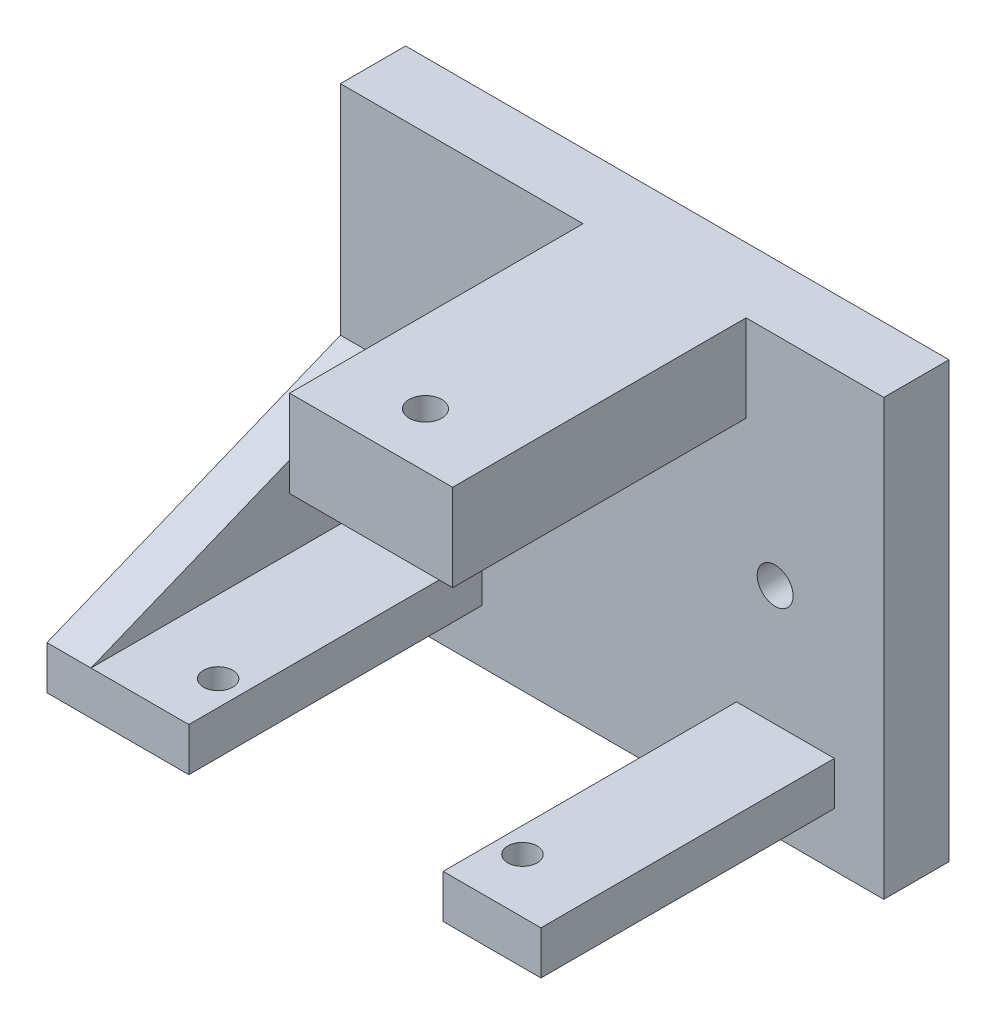
ISO-10303-21;
HEADER;
FILE_DESCRIPTION(('STEP AP214'),'2;1');
FILE_NAME('part.step','',(''),(''),'','','');
FILE_SCHEMA(('AUTOMOTIVE_DESIGN { 1 0 10303 214 1 1 1 1 }'));
ENDSEC;
DATA;
#1=APPLICATION_CONTEXT('core data for automotive mechanical design processes');
#2=APPLICATION_PROTOCOL_DEFINITION('international standard','automotive_design',2000,#1);
#3=PRODUCT_CONTEXT('',#1,'mechanical');
#4=PRODUCT('Part','Part','',(#3));
#5=PRODUCT_RELATED_PRODUCT_CATEGORY('part','',(#4));
#6=PRODUCT_DEFINITION_FORMATION('','',#4);
#7=PRODUCT_DEFINITION_CONTEXT('part definition',#1,'design');
#8=PRODUCT_DEFINITION('design','',#6,#7);
#9=PRODUCT_DEFINITION_SHAPE('','',#8);
#10=(LENGTH_UNIT() NAMED_UNIT(*) SI_UNIT(.MILLI.,.METRE.));
#11=(NAMED_UNIT(*) PLANE_ANGLE_UNIT() SI_UNIT($,.RADIAN.));
#12=(NAMED_UNIT(*) SI_UNIT($,.STERADIAN.) SOLID_ANGLE_UNIT());
#13=UNCERTAINTY_MEASURE_WITH_UNIT(LENGTH_MEASURE(1.E-05),#10,'distance_accuracy_value','');
#14=(GEOMETRIC_REPRESENTATION_CONTEXT(3) GLOBAL_UNCERTAINTY_ASSIGNED_CONTEXT((#13)) GLOBAL_UNIT_ASSIGNED_CONTEXT((#10,
#11,#12)) REPRESENTATION_CONTEXT('',''));
#15=CARTESIAN_POINT('',(0.,0.,0.));
#16=DIRECTION('',(0.,0.,1.));
#17=DIRECTION('',(1.,0.,0.));
#18=AXIS2_PLACEMENT_3D('',#15,#16,#17);
#19=CARTESIAN_POINT('',(0.,0.,6.));
#20=DIRECTION('',(0.,0.,1.));
#21=DIRECTION('',(1.,0.,0.));
#22=AXIS2_PLACEMENT_3D('',#19,#20,#21);
#23=PLANE('',#22);
#24=DIRECTION('',(0.,1.,0.));
#25=VECTOR('',#24,1.);
#26=CARTESIAN_POINT('',(231.451074565597,12.,6.));
#27=LINE('',#26,#25);
#28=CARTESIAN_POINT('',(231.451074565597,12.,6.));
#29=VERTEX_POINT('',#28);
#30=CARTESIAN_POINT('',(231.451074565597,20.,6.));
#31=VERTEX_POINT('',#30);
#32=EDGE_CURVE('E183',#29,#31,#27,.T.);
#33=ORIENTED_EDGE('',*,*,#32,.T.);
#34=DIRECTION('',(-1.,0.,0.));
#35=VECTOR('',#34,1.);
#36=CARTESIAN_POINT('',(209.126074565596,20.,6.));
#37=LINE('',#36,#35);
#38=CARTESIAN_POINT('',(209.126074565596,20.,6.));
#39=VERTEX_POINT('',#38);
#40=EDGE_CURVE('E300',#31,#39,#37,.T.);
#41=ORIENTED_EDGE('',*,*,#40,.T.);
#42=DIRECTION('',(0.,-1.,0.));
#43=VECTOR('',#42,1.);
#44=CARTESIAN_POINT('',(209.126074565596,20.,6.));
#45=LINE('',#44,#43);
#46=CARTESIAN_POINT('',(209.126074565596,-0.0416427874293489,6.));
#47=VERTEX_POINT('',#46);
#48=EDGE_CURVE('E305',#39,#47,#45,.T.);
#49=ORIENTED_EDGE('',*,*,#48,.T.);
#50=DIRECTION('',(1.,0.,0.));
#51=VECTOR('',#50,1.);
#52=CARTESIAN_POINT('',(178.239184142635,-0.0416427874293489,6.));
#53=LINE('',#52,#51);
#54=CARTESIAN_POINT('',(213.176074565597,-0.0416427874293489,6.));
#55=VERTEX_POINT('',#54);
#56=EDGE_CURVE('E217',#47,#55,#53,.T.);
#57=ORIENTED_EDGE('',*,*,#56,.T.);
#58=DIRECTION('',(0.,-1.,0.));
#59=VECTOR('',#58,1.);
#60=CARTESIAN_POINT('',(213.176074565597,-15.0416427874293,6.));
#61=LINE('',#60,#59);
#62=CARTESIAN_POINT('',(213.176074565597,-11.0416427874293,6.));
#63=VERTEX_POINT('',#62);
#64=EDGE_CURVE('E214',#55,#63,#61,.T.);
#65=ORIENTED_EDGE('',*,*,#64,.T.);
#66=DIRECTION('',(-1.,0.,0.));
#67=VECTOR('',#66,1.);
#68=CARTESIAN_POINT('',(213.176074565597,-11.0416427874293,6.));
#69=LINE('',#68,#67);
#70=CARTESIAN_POINT('',(222.176074565597,-11.0416427874293,6.));
#71=VERTEX_POINT('',#70);
#72=EDGE_CURVE('E274',#71,#63,#69,.T.);
#73=ORIENTED_EDGE('',*,*,#72,.F.);
#74=DIRECTION('',(0.,1.,0.));
#75=VECTOR('',#74,1.);
#76=CARTESIAN_POINT('',(222.176074565597,-11.0416427874293,6.));
#77=LINE('',#76,#75);
#78=CARTESIAN_POINT('',(222.176074565597,-15.0416427874294,6.));
#79=VERTEX_POINT('',#78);
#80=EDGE_CURVE('E254',#79,#71,#77,.T.);
#81=ORIENTED_EDGE('',*,*,#80,.F.);
#82=DIRECTION('',(1.,0.,0.));
#83=VECTOR('',#82,1.);
#84=CARTESIAN_POINT('',(213.176074565597,-15.0416427874293,6.));
#85=LINE('',#84,#83);
#86=CARTESIAN_POINT('',(209.126074565596,-15.0416427874293,6.));
#87=VERTEX_POINT('',#86);
#88=EDGE_CURVE('E266',#87,#79,#85,.T.);
#89=ORIENTED_EDGE('',*,*,#88,.F.);
#90=CARTESIAN_POINT('',(209.126074565596,-20.,6.));
#91=VERTEX_POINT('',#90);
#92=EDGE_CURVE('E304',#87,#91,#45,.T.);
#93=ORIENTED_EDGE('',*,*,#92,.T.);
#94=DIRECTION('',(1.,0.,0.));
#95=VECTOR('',#94,1.);
#96=CARTESIAN_POINT('',(209.126074565596,-20.,6.));
#97=LINE('',#96,#95);
#98=CARTESIAN_POINT('',(259.126074565596,-20.,6.));
#99=VERTEX_POINT('',#98);
#100=EDGE_CURVE('E308',#91,#99,#97,.T.);
#101=ORIENTED_EDGE('',*,*,#100,.T.);
#102=DIRECTION('',(0.,1.,0.));
#103=VECTOR('',#102,1.);
#104=CARTESIAN_POINT('',(259.126074565596,20.,6.));
#105=LINE('',#104,#103);
#106=CARTESIAN_POINT('',(259.126074565596,20.,6.));
#107=VERTEX_POINT('',#106);
#108=EDGE_CURVE('E297',#99,#107,#105,.T.);
#109=ORIENTED_EDGE('',*,*,#108,.T.);
#110=CARTESIAN_POINT('',(246.451074565597,20.,6.));
#111=VERTEX_POINT('',#110);
#112=EDGE_CURVE('E302',#107,#111,#37,.T.);
#113=ORIENTED_EDGE('',*,*,#112,.T.);
#114=DIRECTION('',(0.,1.,0.));
#115=VECTOR('',#114,1.);
#116=CARTESIAN_POINT('',(246.451074565597,12.,6.));
#117=LINE('',#116,#115);
#118=CARTESIAN_POINT('',(246.451074565597,12.,6.));
#119=VERTEX_POINT('',#118);
#120=EDGE_CURVE('E61',#119,#111,#117,.T.);
#121=ORIENTED_EDGE('',*,*,#120,.F.);
#122=DIRECTION('',(-1.,0.,0.));
#123=VECTOR('',#122,1.);
#124=CARTESIAN_POINT('',(246.451074565597,12.,6.));
#125=LINE('',#124,#123);
#126=EDGE_CURVE('E56',#119,#29,#125,.T.);
#127=ORIENTED_EDGE('',*,*,#126,.T.);
#128=EDGE_LOOP('',(#33,#41,#49,#57,#65,#73,#81,#89,#93,#101,#109,#113,#121,#127));
#129=FACE_BOUND('',#128,.T.);
#130=CARTESIAN_POINT('',(219.126074565596,1.2490009027033E-13,6.));
#131=DIRECTION('',(0.,0.,1.));
#132=DIRECTION('',(1.,0.,0.));
#133=AXIS2_PLACEMENT_3D('',#130,#131,#132);
#134=CIRCLE('',#133,1.65000000000002);
#135=CARTESIAN_POINT('',(220.776074565596,1.2490009027033E-13,6.));
#136=VERTEX_POINT('',#135);
#137=EDGE_CURVE('E291',#136,#136,#134,.T.);
#138=ORIENTED_EDGE('',*,*,#137,.F.);
#139=EDGE_LOOP('',(#138));
#140=FACE_BOUND('',#139,.T.);
#141=CARTESIAN_POINT('',(249.126074565596,1.2490009027033E-13,6.));
#142=DIRECTION('',(0.,0.,1.));
#143=DIRECTION('',(1.,0.,0.));
#144=AXIS2_PLACEMENT_3D('',#141,#142,#143);
#145=CIRCLE('',#144,1.64999999999999);
#146=CARTESIAN_POINT('',(250.776074565596,1.2490009027033E-13,6.));
#147=VERTEX_POINT('',#146);
#148=EDGE_CURVE('E285',#147,#147,#145,.T.);
#149=ORIENTED_EDGE('',*,*,#148,.F.);
#150=EDGE_LOOP('',(#149));
#151=FACE_BOUND('',#150,.T.);
#152=DIRECTION('',(-1.,0.,0.));
#153=VECTOR('',#152,1.);
#154=CARTESIAN_POINT('',(254.576074565597,-11.0416427874293,6.));
#155=LINE('',#154,#153);
#156=CARTESIAN_POINT('',(254.576074565597,-11.0416427874293,6.));
#157=VERTEX_POINT('',#156);
#158=CARTESIAN_POINT('',(245.576074565597,-11.0416427874293,6.));
#159=VERTEX_POINT('',#158);
#160=EDGE_CURVE('E249',#157,#159,#155,.T.);
#161=ORIENTED_EDGE('',*,*,#160,.F.);
#162=DIRECTION('',(0.,1.,0.));
#163=VECTOR('',#162,1.);
#164=CARTESIAN_POINT('',(254.576074565597,-11.0416427874293,6.));
#165=LINE('',#164,#163);
#166=CARTESIAN_POINT('',(254.576074565597,-15.0416427874293,6.));
#167=VERTEX_POINT('',#166);
#168=EDGE_CURVE('E251',#167,#157,#165,.T.);
#169=ORIENTED_EDGE('',*,*,#168,.F.);
#170=DIRECTION('',(1.,0.,0.));
#171=VECTOR('',#170,1.);
#172=CARTESIAN_POINT('',(254.576074565597,-15.0416427874293,6.));
#173=LINE('',#172,#171);
#174=CARTESIAN_POINT('',(245.576074565597,-15.0416427874293,6.));
#175=VERTEX_POINT('',#174);
#176=EDGE_CURVE('E243',#175,#167,#173,.T.);
#177=ORIENTED_EDGE('',*,*,#176,.F.);
#178=DIRECTION('',(0.,-1.,0.));
#179=VECTOR('',#178,1.);
#180=CARTESIAN_POINT('',(245.576074565597,-11.0416427874293,6.));
#181=LINE('',#180,#179);
#182=EDGE_CURVE('E245',#159,#175,#181,.T.);
#183=ORIENTED_EDGE('',*,*,#182,.F.);
#184=EDGE_LOOP('',(#161,#169,#177,#183));
#185=FACE_BOUND('',#184,.T.);
#186=ADVANCED_FACE('F41',(#129,#140,#151,#185),#23,.T.);
#187=CARTESIAN_POINT('',(0.,0.,0.));
#188=DIRECTION('',(0.,0.,1.));
#189=DIRECTION('',(1.,0.,0.));
#190=AXIS2_PLACEMENT_3D('',#187,#188,#189);
#191=PLANE('',#190);
#192=DIRECTION('',(0.,1.,0.));
#193=VECTOR('',#192,1.);
#194=CARTESIAN_POINT('',(259.126074565596,20.,0.));
#195=LINE('',#194,#193);
#196=CARTESIAN_POINT('',(259.126074565596,-20.,0.));
#197=VERTEX_POINT('',#196);
#198=CARTESIAN_POINT('',(259.126074565596,20.,0.));
#199=VERTEX_POINT('',#198);
#200=EDGE_CURVE('E294',#197,#199,#195,.T.);
#201=ORIENTED_EDGE('',*,*,#200,.F.);
#202=DIRECTION('',(1.,0.,0.));
#203=VECTOR('',#202,1.);
#204=CARTESIAN_POINT('',(209.126074565596,-20.,0.));
#205=LINE('',#204,#203);
#206=CARTESIAN_POINT('',(209.126074565596,-20.,0.));
#207=VERTEX_POINT('',#206);
#208=EDGE_CURVE('E301',#207,#197,#205,.T.);
#209=ORIENTED_EDGE('',*,*,#208,.F.);
#210=DIRECTION('',(0.,-1.,0.));
#211=VECTOR('',#210,1.);
#212=CARTESIAN_POINT('',(209.126074565596,20.,0.));
#213=LINE('',#212,#211);
#214=CARTESIAN_POINT('',(209.126074565596,20.,0.));
#215=VERTEX_POINT('',#214);
#216=EDGE_CURVE('E315',#215,#207,#213,.T.);
#217=ORIENTED_EDGE('',*,*,#216,.F.);
#218=DIRECTION('',(-1.,0.,0.));
#219=VECTOR('',#218,1.);
#220=CARTESIAN_POINT('',(209.126074565596,20.,0.));
#221=LINE('',#220,#219);
#222=EDGE_CURVE('E313',#199,#215,#221,.T.);
#223=ORIENTED_EDGE('',*,*,#222,.F.);
#224=EDGE_LOOP('',(#201,#209,#217,#223));
#225=FACE_BOUND('',#224,.T.);
#226=CARTESIAN_POINT('',(219.126074565596,1.2490009027033E-13,0.));
#227=DIRECTION('',(0.,0.,1.));
#228=DIRECTION('',(1.,0.,0.));
#229=AXIS2_PLACEMENT_3D('',#226,#227,#228);
#230=CIRCLE('',#229,1.65000000000002);
#231=CARTESIAN_POINT('',(220.776074565596,1.2490009027033E-13,0.));
#232=VERTEX_POINT('',#231);
#233=EDGE_CURVE('E288',#232,#232,#230,.T.);
#234=ORIENTED_EDGE('',*,*,#233,.T.);
#235=EDGE_LOOP('',(#234));
#236=FACE_BOUND('',#235,.T.);
#237=CARTESIAN_POINT('',(249.126074565596,1.2490009027033E-13,0.));
#238=DIRECTION('',(0.,0.,1.));
#239=DIRECTION('',(1.,0.,0.));
#240=AXIS2_PLACEMENT_3D('',#237,#238,#239);
#241=CIRCLE('',#240,1.64999999999999);
#242=CARTESIAN_POINT('',(250.776074565596,1.2490009027033E-13,0.));
#243=VERTEX_POINT('',#242);
#244=EDGE_CURVE('E284',#243,#243,#241,.T.);
#245=ORIENTED_EDGE('',*,*,#244,.T.);
#246=EDGE_LOOP('',(#245));
#247=FACE_BOUND('',#246,.T.);
#248=ADVANCED_FACE('F333',(#225,#236,#247),#191,.F.);
#249=CARTESIAN_POINT('',(259.126074565596,20.,6.));
#250=DIRECTION('',(-1.,0.,0.));
#251=DIRECTION('',(0.,0.,1.));
#252=AXIS2_PLACEMENT_3D('',#249,#250,#251);
#253=PLANE('',#252);
#254=ORIENTED_EDGE('',*,*,#200,.T.);
#255=DIRECTION('',(0.,0.,-1.));
#256=VECTOR('',#255,1.);
#257=CARTESIAN_POINT('',(259.126074565596,20.,6.));
#258=LINE('',#257,#256);
#259=EDGE_CURVE('E11',#107,#199,#258,.T.);
#260=ORIENTED_EDGE('',*,*,#259,.F.);
#261=ORIENTED_EDGE('',*,*,#108,.F.);
#262=DIRECTION('',(0.,0.,-1.));
#263=VECTOR('',#262,1.);
#264=CARTESIAN_POINT('',(259.126074565596,-20.,6.));
#265=LINE('',#264,#263);
#266=EDGE_CURVE('E310',#99,#197,#265,.T.);
#267=ORIENTED_EDGE('',*,*,#266,.T.);
#268=EDGE_LOOP('',(#254,#260,#261,#267));
#269=FACE_BOUND('',#268,.T.);
#270=ADVANCED_FACE('F43',(#269),#253,.F.);
#271=CARTESIAN_POINT('',(209.126074565596,20.,6.));
#272=DIRECTION('',(0.,-1.,0.));
#273=DIRECTION('',(0.,0.,-1.));
#274=AXIS2_PLACEMENT_3D('',#271,#272,#273);
#275=PLANE('',#274);
#276=ORIENTED_EDGE('',*,*,#222,.T.);
#277=DIRECTION('',(0.,0.,-1.));
#278=VECTOR('',#277,1.);
#279=CARTESIAN_POINT('',(209.126074565596,20.,6.));
#280=LINE('',#279,#278);
#281=EDGE_CURVE('E49',#39,#215,#280,.T.);
#282=ORIENTED_EDGE('',*,*,#281,.F.);
#283=ORIENTED_EDGE('',*,*,#40,.F.);
#284=DIRECTION('',(0.,0.,1.));
#285=VECTOR('',#284,1.);
#286=CARTESIAN_POINT('',(231.451074565597,20.,33.));
#287=LINE('',#286,#285);
#288=CARTESIAN_POINT('',(231.451074565597,20.,33.));
#289=VERTEX_POINT('',#288);
#290=EDGE_CURVE('E194',#31,#289,#287,.T.);
#291=ORIENTED_EDGE('',*,*,#290,.T.);
#292=DIRECTION('',(1.,0.,0.));
#293=VECTOR('',#292,1.);
#294=CARTESIAN_POINT('',(246.451074565597,20.,33.));
#295=LINE('',#294,#293);
#296=CARTESIAN_POINT('',(246.451074565597,20.,33.));
#297=VERTEX_POINT('',#296);
#298=EDGE_CURVE('E168',#289,#297,#295,.T.);
#299=ORIENTED_EDGE('',*,*,#298,.T.);
#300=DIRECTION('',(0.,0.,-1.));
#301=VECTOR('',#300,1.);
#302=CARTESIAN_POINT('',(246.451074565597,20.,33.));
#303=LINE('',#302,#301);
#304=EDGE_CURVE('E184',#297,#111,#303,.T.);
#305=ORIENTED_EDGE('',*,*,#304,.T.);
#306=ORIENTED_EDGE('',*,*,#112,.F.);
#307=ORIENTED_EDGE('',*,*,#259,.T.);
#308=EDGE_LOOP('',(#276,#282,#283,#291,#299,#305,#306,#307));
#309=FACE_BOUND('',#308,.T.);
#310=CARTESIAN_POINT('',(238.951074565597,20.,28.));
#311=DIRECTION('',(0.,1.,0.));
#312=DIRECTION('',(0.,0.,1.));
#313=AXIS2_PLACEMENT_3D('',#310,#311,#312);
#314=CIRCLE('',#313,1.5);
#315=CARTESIAN_POINT('',(238.951074565597,20.,29.5));
#316=VERTEX_POINT('',#315);
#317=EDGE_CURVE('E189',#316,#316,#314,.T.);
#318=ORIENTED_EDGE('',*,*,#317,.F.);
#319=EDGE_LOOP('',(#318));
#320=FACE_BOUND('',#319,.T.);
#321=ADVANCED_FACE('F357',(#309,#320),#275,.F.);
#322=CARTESIAN_POINT('',(209.126074565596,20.,6.));
#323=DIRECTION('',(1.,0.,0.));
#324=DIRECTION('',(0.,0.,-1.));
#325=AXIS2_PLACEMENT_3D('',#322,#323,#324);
#326=PLANE('',#325);
#327=ORIENTED_EDGE('',*,*,#216,.T.);
#328=DIRECTION('',(0.,0.,-1.));
#329=VECTOR('',#328,1.);
#330=CARTESIAN_POINT('',(209.126074565596,-20.,6.));
#331=LINE('',#330,#329);
#332=EDGE_CURVE('E320',#91,#207,#331,.T.);
#333=ORIENTED_EDGE('',*,*,#332,.F.);
#334=ORIENTED_EDGE('',*,*,#92,.F.);
#335=DIRECTION('',(0.,0.,-1.));
#336=VECTOR('',#335,1.);
#337=CARTESIAN_POINT('',(209.126074565596,-15.0416427874293,33.));
#338=LINE('',#337,#336);
#339=CARTESIAN_POINT('',(209.126074565596,-15.0416427874293,33.));
#340=VERTEX_POINT('',#339);
#341=EDGE_CURVE('E209',#340,#87,#338,.T.);
#342=ORIENTED_EDGE('',*,*,#341,.F.);
#343=DIRECTION('',(0.,-1.,0.));
#344=VECTOR('',#343,1.);
#345=CARTESIAN_POINT('',(209.126074565596,-11.0416427874293,33.));
#346=LINE('',#345,#344);
#347=CARTESIAN_POINT('',(209.126074565596,-11.0416427874293,33.));
#348=VERTEX_POINT('',#347);
#349=EDGE_CURVE('E205',#348,#340,#346,.T.);
#350=ORIENTED_EDGE('',*,*,#349,.F.);
#351=DIRECTION('',(0.,-0.37729688731352,0.926092359769548));
#352=VECTOR('',#351,1.);
#353=CARTESIAN_POINT('',(209.126074565596,-0.0416427874293489,6.));
#354=LINE('',#353,#352);
#355=EDGE_CURVE('E202',#47,#348,#354,.T.);
#356=ORIENTED_EDGE('',*,*,#355,.F.);
#357=ORIENTED_EDGE('',*,*,#48,.F.);
#358=ORIENTED_EDGE('',*,*,#281,.T.);
#359=EDGE_LOOP('',(#327,#333,#334,#342,#350,#356,#357,#358));
#360=FACE_BOUND('',#359,.T.);
#361=ADVANCED_FACE('F327',(#360),#326,.F.);
#362=CARTESIAN_POINT('',(209.126074565596,-20.,6.));
#363=DIRECTION('',(0.,1.,0.));
#364=DIRECTION('',(0.,0.,1.));
#365=AXIS2_PLACEMENT_3D('',#362,#363,#364);
#366=PLANE('',#365);
#367=ORIENTED_EDGE('',*,*,#208,.T.);
#368=ORIENTED_EDGE('',*,*,#266,.F.);
#369=ORIENTED_EDGE('',*,*,#100,.F.);
#370=ORIENTED_EDGE('',*,*,#332,.T.);
#371=EDGE_LOOP('',(#367,#368,#369,#370));
#372=FACE_BOUND('',#371,.T.);
#373=ADVANCED_FACE('F337',(#372),#366,.F.);
#374=CARTESIAN_POINT('',(219.126074565596,1.2490009027033E-13,6.));
#375=DIRECTION('',(0.,0.,-1.));
#376=DIRECTION('',(-1.,0.,0.));
#377=AXIS2_PLACEMENT_3D('',#374,#375,#376);
#378=CYLINDRICAL_SURFACE('',#377,1.65000000000002);
#379=ORIENTED_EDGE('',*,*,#137,.T.);
#380=EDGE_LOOP('',(#379));
#381=FACE_BOUND('',#380,.T.);
#382=ORIENTED_EDGE('',*,*,#233,.F.);
#383=EDGE_LOOP('',(#382));
#384=FACE_BOUND('',#383,.T.);
#385=ADVANCED_FACE('F378',(#381,#384),#378,.F.);
#386=CARTESIAN_POINT('',(249.126074565596,1.2490009027033E-13,6.));
#387=DIRECTION('',(0.,0.,-1.));
#388=DIRECTION('',(-1.,0.,0.));
#389=AXIS2_PLACEMENT_3D('',#386,#387,#388);
#390=CYLINDRICAL_SURFACE('',#389,1.64999999999999);
#391=ORIENTED_EDGE('',*,*,#148,.T.);
#392=EDGE_LOOP('',(#391));
#393=FACE_BOUND('',#392,.T.);
#394=ORIENTED_EDGE('',*,*,#244,.F.);
#395=EDGE_LOOP('',(#394));
#396=FACE_BOUND('',#395,.T.);
#397=ADVANCED_FACE('F439',(#393,#396),#390,.F.);
#398=CARTESIAN_POINT('',(222.176074565597,-11.0416427874293,33.));
#399=DIRECTION('',(-1.,0.,0.));
#400=DIRECTION('',(0.,0.,1.));
#401=AXIS2_PLACEMENT_3D('',#398,#399,#400);
#402=PLANE('',#401);
#403=ORIENTED_EDGE('',*,*,#80,.T.);
#404=DIRECTION('',(0.,0.,-1.));
#405=VECTOR('',#404,1.);
#406=CARTESIAN_POINT('',(222.176074565597,-11.0416427874293,33.));
#407=LINE('',#406,#405);
#408=CARTESIAN_POINT('',(222.176074565597,-11.0416427874293,33.));
#409=VERTEX_POINT('',#408);
#410=EDGE_CURVE('E282',#409,#71,#407,.T.);
#411=ORIENTED_EDGE('',*,*,#410,.F.);
#412=DIRECTION('',(0.,1.,0.));
#413=VECTOR('',#412,1.);
#414=CARTESIAN_POINT('',(222.176074565597,-11.0416427874293,33.));
#415=LINE('',#414,#413);
#416=CARTESIAN_POINT('',(222.176074565597,-15.0416427874294,33.));
#417=VERTEX_POINT('',#416);
#418=EDGE_CURVE('E262',#417,#409,#415,.T.);
#419=ORIENTED_EDGE('',*,*,#418,.F.);
#420=DIRECTION('',(0.,0.,-1.));
#421=VECTOR('',#420,1.);
#422=CARTESIAN_POINT('',(222.176074565597,-15.0416427874294,33.));
#423=LINE('',#422,#421);
#424=EDGE_CURVE('E271',#417,#79,#423,.T.);
#425=ORIENTED_EDGE('',*,*,#424,.T.);
#426=EDGE_LOOP('',(#403,#411,#419,#425));
#427=FACE_BOUND('',#426,.T.);
#428=ADVANCED_FACE('F449',(#427),#402,.F.);
#429=CARTESIAN_POINT('',(213.176074565597,-11.0416427874293,33.));
#430=DIRECTION('',(0.,-1.,0.));
#431=DIRECTION('',(0.,0.,-1.));
#432=AXIS2_PLACEMENT_3D('',#429,#430,#431);
#433=PLANE('',#432);
#434=CARTESIAN_POINT('',(219.876074565597,-11.0416427874293,28.));
#435=DIRECTION('',(0.,-1.,0.));
#436=DIRECTION('',(0.,0.,-1.));
#437=AXIS2_PLACEMENT_3D('',#434,#435,#436);
#438=CIRCLE('',#437,1.34999999999998);
#439=CARTESIAN_POINT('',(219.876074565597,-11.0416427874293,26.65));
#440=VERTEX_POINT('',#439);
#441=EDGE_CURVE('E229',#440,#440,#438,.T.);
#442=ORIENTED_EDGE('',*,*,#441,.T.);
#443=EDGE_LOOP('',(#442));
#444=FACE_BOUND('',#443,.T.);
#445=ORIENTED_EDGE('',*,*,#72,.T.);
#446=DIRECTION('',(0.,0.,-1.));
#447=VECTOR('',#446,1.);
#448=CARTESIAN_POINT('',(213.176074565597,-11.0416427874293,33.));
#449=LINE('',#448,#447);
#450=CARTESIAN_POINT('',(213.176074565597,-11.0416427874293,33.));
#451=VERTEX_POINT('',#450);
#452=EDGE_CURVE('E280',#451,#63,#449,.T.);
#453=ORIENTED_EDGE('',*,*,#452,.F.);
#454=DIRECTION('',(-1.,0.,0.));
#455=VECTOR('',#454,1.);
#456=CARTESIAN_POINT('',(213.176074565597,-11.0416427874293,33.));
#457=LINE('',#456,#455);
#458=EDGE_CURVE('E265',#409,#451,#457,.T.);
#459=ORIENTED_EDGE('',*,*,#458,.F.);
#460=ORIENTED_EDGE('',*,*,#410,.T.);
#461=EDGE_LOOP('',(#445,#453,#459,#460));
#462=FACE_BOUND('',#461,.T.);
#463=ADVANCED_FACE('F466',(#444,#462),#433,.F.);
#464=CARTESIAN_POINT('',(213.176074565597,-15.0416427874293,33.));
#465=DIRECTION('',(0.,1.,0.));
#466=DIRECTION('',(-1.,0.,0.));
#467=AXIS2_PLACEMENT_3D('',#464,#465,#466);
#468=PLANE('',#467);
#469=CARTESIAN_POINT('',(219.876074565597,-15.0416427874294,28.));
#470=DIRECTION('',(0.,-1.,0.));
#471=DIRECTION('',(-1.,0.,0.));
#472=AXIS2_PLACEMENT_3D('',#469,#470,#471);
#473=CIRCLE('',#472,1.34999999999998);
#474=CARTESIAN_POINT('',(218.526074565597,-15.0416427874294,28.));
#475=VERTEX_POINT('',#474);
#476=EDGE_CURVE('E212',#475,#475,#473,.T.);
#477=ORIENTED_EDGE('',*,*,#476,.F.);
#478=EDGE_LOOP('',(#477));
#479=FACE_BOUND('',#478,.T.);
#480=ORIENTED_EDGE('',*,*,#88,.T.);
#481=ORIENTED_EDGE('',*,*,#424,.F.);
#482=DIRECTION('',(1.,0.,0.));
#483=VECTOR('',#482,1.);
#484=CARTESIAN_POINT('',(213.176074565597,-15.0416427874293,33.));
#485=LINE('',#484,#483);
#486=EDGE_CURVE('E269',#340,#417,#485,.T.);
#487=ORIENTED_EDGE('',*,*,#486,.F.);
#488=ORIENTED_EDGE('',*,*,#341,.T.);
#489=EDGE_LOOP('',(#480,#481,#487,#488));
#490=FACE_BOUND('',#489,.T.);
#491=ADVANCED_FACE('F478',(#479,#490),#468,.F.);
#492=CARTESIAN_POINT('',(0.,0.,33.));
#493=DIRECTION('',(0.,0.,1.));
#494=DIRECTION('',(1.,0.,0.));
#495=AXIS2_PLACEMENT_3D('',#492,#493,#494);
#496=PLANE('',#495);
#497=ORIENTED_EDGE('',*,*,#418,.T.);
#498=ORIENTED_EDGE('',*,*,#458,.T.);
#499=DIRECTION('',(1.,0.,0.));
#500=VECTOR('',#499,1.);
#501=CARTESIAN_POINT('',(178.239184142635,-11.0416427874293,33.));
#502=LINE('',#501,#500);
#503=EDGE_CURVE('E206',#348,#451,#502,.T.);
#504=ORIENTED_EDGE('',*,*,#503,.F.);
#505=ORIENTED_EDGE('',*,*,#349,.T.);
#506=ORIENTED_EDGE('',*,*,#486,.T.);
#507=EDGE_LOOP('',(#497,#498,#504,#505,#506));
#508=FACE_BOUND('',#507,.T.);
#509=ADVANCED_FACE('F349',(#508),#496,.T.);
#510=CARTESIAN_POINT('',(254.576074565597,-11.0416427874293,33.));
#511=DIRECTION('',(-1.,0.,0.));
#512=DIRECTION('',(0.,0.,1.));
#513=AXIS2_PLACEMENT_3D('',#510,#511,#512);
#514=PLANE('',#513);
#515=ORIENTED_EDGE('',*,*,#168,.T.);
#516=DIRECTION('',(0.,0.,-1.));
#517=VECTOR('',#516,1.);
#518=CARTESIAN_POINT('',(254.576074565597,-11.0416427874293,33.));
#519=LINE('',#518,#517);
#520=CARTESIAN_POINT('',(254.576074565597,-11.0416427874293,33.));
#521=VERTEX_POINT('',#520);
#522=EDGE_CURVE('E232',#521,#157,#519,.T.);
#523=ORIENTED_EDGE('',*,*,#522,.F.);
#524=DIRECTION('',(0.,1.,0.));
#525=VECTOR('',#524,1.);
#526=CARTESIAN_POINT('',(254.576074565597,-11.0416427874293,33.));
#527=LINE('',#526,#525);
#528=CARTESIAN_POINT('',(254.576074565597,-15.0416427874293,33.));
#529=VERTEX_POINT('',#528);
#530=EDGE_CURVE('E246',#529,#521,#527,.T.);
#531=ORIENTED_EDGE('',*,*,#530,.F.);
#532=DIRECTION('',(0.,0.,-1.));
#533=VECTOR('',#532,1.);
#534=CARTESIAN_POINT('',(254.576074565597,-15.0416427874293,33.));
#535=LINE('',#534,#533);
#536=EDGE_CURVE('E239',#529,#167,#535,.T.);
#537=ORIENTED_EDGE('',*,*,#536,.T.);
#538=EDGE_LOOP('',(#515,#523,#531,#537));
#539=FACE_BOUND('',#538,.T.);
#540=ADVANCED_FACE('F500',(#539),#514,.F.);
#541=CARTESIAN_POINT('',(254.576074565597,-11.0416427874293,33.));
#542=DIRECTION('',(0.,-1.,0.));
#543=DIRECTION('',(1.,0.,0.));
#544=AXIS2_PLACEMENT_3D('',#541,#542,#543);
#545=PLANE('',#544);
#546=CARTESIAN_POINT('',(247.876074565597,-11.0416427874293,28.));
#547=DIRECTION('',(0.,-1.,0.));
#548=DIRECTION('',(1.,0.,0.));
#549=AXIS2_PLACEMENT_3D('',#546,#547,#548);
#550=CIRCLE('',#549,1.34999999999998);
#551=CARTESIAN_POINT('',(249.226074565597,-11.0416427874293,28.));
#552=VERTEX_POINT('',#551);
#553=EDGE_CURVE('E224',#552,#552,#550,.T.);
#554=ORIENTED_EDGE('',*,*,#553,.T.);
#555=EDGE_LOOP('',(#554));
#556=FACE_BOUND('',#555,.T.);
#557=ORIENTED_EDGE('',*,*,#160,.T.);
#558=DIRECTION('',(0.,0.,-1.));
#559=VECTOR('',#558,1.);
#560=CARTESIAN_POINT('',(245.576074565597,-11.0416427874293,33.));
#561=LINE('',#560,#559);
#562=CARTESIAN_POINT('',(245.576074565597,-11.0416427874293,33.));
#563=VERTEX_POINT('',#562);
#564=EDGE_CURVE('E234',#563,#159,#561,.T.);
#565=ORIENTED_EDGE('',*,*,#564,.F.);
#566=DIRECTION('',(-1.,0.,0.));
#567=VECTOR('',#566,1.);
#568=CARTESIAN_POINT('',(254.576074565597,-11.0416427874293,33.));
#569=LINE('',#568,#567);
#570=EDGE_CURVE('E258',#521,#563,#569,.T.);
#571=ORIENTED_EDGE('',*,*,#570,.F.);
#572=ORIENTED_EDGE('',*,*,#522,.T.);
#573=EDGE_LOOP('',(#557,#565,#571,#572));
#574=FACE_BOUND('',#573,.T.);
#575=ADVANCED_FACE('F512',(#556,#574),#545,.F.);
#576=CARTESIAN_POINT('',(245.576074565597,-11.0416427874293,33.));
#577=DIRECTION('',(1.,0.,0.));
#578=DIRECTION('',(0.,0.,-1.));
#579=AXIS2_PLACEMENT_3D('',#576,#577,#578);
#580=PLANE('',#579);
#581=ORIENTED_EDGE('',*,*,#182,.T.);
#582=DIRECTION('',(0.,0.,-1.));
#583=VECTOR('',#582,1.);
#584=CARTESIAN_POINT('',(245.576074565597,-15.0416427874293,33.));
#585=LINE('',#584,#583);
#586=CARTESIAN_POINT('',(245.576074565597,-15.0416427874293,33.));
#587=VERTEX_POINT('',#586);
#588=EDGE_CURVE('E237',#587,#175,#585,.T.);
#589=ORIENTED_EDGE('',*,*,#588,.F.);
#590=DIRECTION('',(0.,-1.,0.));
#591=VECTOR('',#590,1.);
#592=CARTESIAN_POINT('',(245.576074565597,-11.0416427874293,33.));
#593=LINE('',#592,#591);
#594=EDGE_CURVE('E256',#563,#587,#593,.T.);
#595=ORIENTED_EDGE('',*,*,#594,.F.);
#596=ORIENTED_EDGE('',*,*,#564,.T.);
#597=EDGE_LOOP('',(#581,#589,#595,#596));
#598=FACE_BOUND('',#597,.T.);
#599=ADVANCED_FACE('F524',(#598),#580,.F.);
#600=CARTESIAN_POINT('',(254.576074565597,-15.0416427874293,33.));
#601=DIRECTION('',(0.,1.,0.));
#602=DIRECTION('',(-1.,0.,0.));
#603=AXIS2_PLACEMENT_3D('',#600,#601,#602);
#604=PLANE('',#603);
#605=CARTESIAN_POINT('',(247.876074565597,-15.0416427874294,28.));
#606=DIRECTION('',(0.,-1.,0.));
#607=DIRECTION('',(1.,0.,0.));
#608=AXIS2_PLACEMENT_3D('',#605,#606,#607);
#609=CIRCLE('',#608,1.34999999999998);
#610=CARTESIAN_POINT('',(249.226074565597,-15.0416427874294,28.));
#611=VERTEX_POINT('',#610);
#612=EDGE_CURVE('E221',#611,#611,#609,.T.);
#613=ORIENTED_EDGE('',*,*,#612,.F.);
#614=EDGE_LOOP('',(#613));
#615=FACE_BOUND('',#614,.T.);
#616=ORIENTED_EDGE('',*,*,#176,.T.);
#617=ORIENTED_EDGE('',*,*,#536,.F.);
#618=DIRECTION('',(1.,0.,0.));
#619=VECTOR('',#618,1.);
#620=CARTESIAN_POINT('',(254.576074565597,-15.0416427874293,33.));
#621=LINE('',#620,#619);
#622=EDGE_CURVE('E242',#587,#529,#621,.T.);
#623=ORIENTED_EDGE('',*,*,#622,.F.);
#624=ORIENTED_EDGE('',*,*,#588,.T.);
#625=EDGE_LOOP('',(#616,#617,#623,#624));
#626=FACE_BOUND('',#625,.T.);
#627=ADVANCED_FACE('F536',(#615,#626),#604,.F.);
#628=CARTESIAN_POINT('',(0.,0.,33.));
#629=DIRECTION('',(0.,0.,-1.));
#630=DIRECTION('',(-1.,0.,0.));
#631=AXIS2_PLACEMENT_3D('',#628,#629,#630);
#632=PLANE('',#631);
#633=ORIENTED_EDGE('',*,*,#530,.T.);
#634=ORIENTED_EDGE('',*,*,#570,.T.);
#635=ORIENTED_EDGE('',*,*,#594,.T.);
#636=ORIENTED_EDGE('',*,*,#622,.T.);
#637=EDGE_LOOP('',(#633,#634,#635,#636));
#638=FACE_BOUND('',#637,.T.);
#639=ADVANCED_FACE('F546',(#638),#632,.F.);
#640=CARTESIAN_POINT('',(247.876074565597,-5.04164278742944,28.));
#641=DIRECTION('',(0.,-1.,0.));
#642=DIRECTION('',(1.,0.,0.));
#643=AXIS2_PLACEMENT_3D('',#640,#641,#642);
#644=CYLINDRICAL_SURFACE('',#643,1.34999999999998);
#645=ORIENTED_EDGE('',*,*,#612,.T.);
#646=EDGE_LOOP('',(#645));
#647=FACE_BOUND('',#646,.T.);
#648=ORIENTED_EDGE('',*,*,#553,.F.);
#649=EDGE_LOOP('',(#648));
#650=FACE_BOUND('',#649,.T.);
#651=ADVANCED_FACE('F557',(#647,#650),#644,.F.);
#652=CARTESIAN_POINT('',(219.876074565597,-5.04164278742945,28.));
#653=DIRECTION('',(0.,-1.,0.));
#654=DIRECTION('',(1.,0.,0.));
#655=AXIS2_PLACEMENT_3D('',#652,#653,#654);
#656=CYLINDRICAL_SURFACE('',#655,1.34999999999998);
#657=ORIENTED_EDGE('',*,*,#476,.T.);
#658=EDGE_LOOP('',(#657));
#659=FACE_BOUND('',#658,.T.);
#660=ORIENTED_EDGE('',*,*,#441,.F.);
#661=EDGE_LOOP('',(#660));
#662=FACE_BOUND('',#661,.T.);
#663=ADVANCED_FACE('F566',(#659,#662),#656,.F.);
#664=CARTESIAN_POINT('',(213.176074565597,0.,0.));
#665=DIRECTION('',(1.,0.,0.));
#666=DIRECTION('',(0.,0.,-1.));
#667=AXIS2_PLACEMENT_3D('',#664,#665,#666);
#668=PLANE('',#667);
#669=ORIENTED_EDGE('',*,*,#452,.T.);
#670=ORIENTED_EDGE('',*,*,#64,.F.);
#671=DIRECTION('',(0.,0.377296887313519,-0.926092359769548));
#672=VECTOR('',#671,1.);
#673=CARTESIAN_POINT('',(213.176074565597,-0.0416427874293489,6.));
#674=LINE('',#673,#672);
#675=EDGE_CURVE('E199',#451,#55,#674,.T.);
#676=ORIENTED_EDGE('',*,*,#675,.F.);
#677=EDGE_LOOP('',(#669,#670,#676));
#678=FACE_BOUND('',#677,.T.);
#679=ADVANCED_FACE('F576',(#678),#668,.T.);
#680=CARTESIAN_POINT('',(178.239184142635,-0.0416427874293489,6.));
#681=DIRECTION('',(0.,-0.926092359769548,-0.377296887313519));
#682=DIRECTION('',(0.,0.37729688731352,-0.926092359769548));
#683=AXIS2_PLACEMENT_3D('',#680,#681,#682);
#684=PLANE('',#683);
#685=ORIENTED_EDGE('',*,*,#56,.F.);
#686=ORIENTED_EDGE('',*,*,#355,.T.);
#687=ORIENTED_EDGE('',*,*,#503,.T.);
#688=ORIENTED_EDGE('',*,*,#675,.T.);
#689=EDGE_LOOP('',(#685,#686,#687,#688));
#690=FACE_BOUND('',#689,.T.);
#691=ADVANCED_FACE('F355',(#690),#684,.F.);
#692=CARTESIAN_POINT('',(231.451074565597,12.,33.));
#693=DIRECTION('',(-1.,0.,0.));
#694=DIRECTION('',(0.,0.,1.));
#695=AXIS2_PLACEMENT_3D('',#692,#693,#694);
#696=PLANE('',#695);
#697=ORIENTED_EDGE('',*,*,#290,.F.);
#698=ORIENTED_EDGE('',*,*,#32,.F.);
#699=DIRECTION('',(0.,0.,1.));
#700=VECTOR('',#699,1.);
#701=CARTESIAN_POINT('',(231.451074565597,12.,33.));
#702=LINE('',#701,#700);
#703=CARTESIAN_POINT('',(231.451074565597,12.,33.));
#704=VERTEX_POINT('',#703);
#705=EDGE_CURVE('E179',#29,#704,#702,.T.);
#706=ORIENTED_EDGE('',*,*,#705,.T.);
#707=DIRECTION('',(0.,1.,0.));
#708=VECTOR('',#707,1.);
#709=CARTESIAN_POINT('',(231.451074565597,12.,33.));
#710=LINE('',#709,#708);
#711=EDGE_CURVE('E163',#704,#289,#710,.T.);
#712=ORIENTED_EDGE('',*,*,#711,.T.);
#713=EDGE_LOOP('',(#697,#698,#706,#712));
#714=FACE_BOUND('',#713,.T.);
#715=ADVANCED_FACE('F182',(#714),#696,.T.);
#716=CARTESIAN_POINT('',(246.451074565597,12.,33.));
#717=DIRECTION('',(1.,0.,0.));
#718=DIRECTION('',(0.,0.,-1.));
#719=AXIS2_PLACEMENT_3D('',#716,#717,#718);
#720=PLANE('',#719);
#721=ORIENTED_EDGE('',*,*,#304,.F.);
#722=DIRECTION('',(0.,1.,0.));
#723=VECTOR('',#722,1.);
#724=CARTESIAN_POINT('',(246.451074565597,12.,33.));
#725=LINE('',#724,#723);
#726=CARTESIAN_POINT('',(246.451074565597,12.,33.));
#727=VERTEX_POINT('',#726);
#728=EDGE_CURVE('E173',#727,#297,#725,.T.);
#729=ORIENTED_EDGE('',*,*,#728,.F.);
#730=DIRECTION('',(0.,0.,-1.));
#731=VECTOR('',#730,1.);
#732=CARTESIAN_POINT('',(246.451074565597,12.,33.));
#733=LINE('',#732,#731);
#734=EDGE_CURVE('E180',#727,#119,#733,.T.);
#735=ORIENTED_EDGE('',*,*,#734,.T.);
#736=ORIENTED_EDGE('',*,*,#120,.T.);
#737=EDGE_LOOP('',(#721,#729,#735,#736));
#738=FACE_BOUND('',#737,.T.);
#739=ADVANCED_FACE('F361',(#738),#720,.T.);
#740=CARTESIAN_POINT('',(246.451074565597,12.,33.));
#741=DIRECTION('',(0.,0.,1.));
#742=DIRECTION('',(1.,0.,0.));
#743=AXIS2_PLACEMENT_3D('',#740,#741,#742);
#744=PLANE('',#743);
#745=ORIENTED_EDGE('',*,*,#298,.F.);
#746=ORIENTED_EDGE('',*,*,#711,.F.);
#747=DIRECTION('',(1.,0.,0.));
#748=VECTOR('',#747,1.);
#749=CARTESIAN_POINT('',(246.451074565597,12.,33.));
#750=LINE('',#749,#748);
#751=EDGE_CURVE('E166',#704,#727,#750,.T.);
#752=ORIENTED_EDGE('',*,*,#751,.T.);
#753=ORIENTED_EDGE('',*,*,#728,.T.);
#754=EDGE_LOOP('',(#745,#746,#752,#753));
#755=FACE_BOUND('',#754,.T.);
#756=ADVANCED_FACE('F165',(#755),#744,.T.);
#757=CARTESIAN_POINT('',(0.,12.,0.));
#758=DIRECTION('',(0.,1.,0.));
#759=DIRECTION('',(0.,0.,1.));
#760=AXIS2_PLACEMENT_3D('',#757,#758,#759);
#761=PLANE('',#760);
#762=CARTESIAN_POINT('',(238.951074565597,12.,28.));
#763=DIRECTION('',(0.,1.,0.));
#764=DIRECTION('',(0.,0.,1.));
#765=AXIS2_PLACEMENT_3D('',#762,#763,#764);
#766=CIRCLE('',#765,1.5);
#767=CARTESIAN_POINT('',(238.951074565597,12.,29.5));
#768=VERTEX_POINT('',#767);
#769=EDGE_CURVE('E196',#768,#768,#766,.T.);
#770=ORIENTED_EDGE('',*,*,#769,.T.);
#771=EDGE_LOOP('',(#770));
#772=FACE_BOUND('',#771,.T.);
#773=ORIENTED_EDGE('',*,*,#705,.F.);
#774=ORIENTED_EDGE('',*,*,#126,.F.);
#775=ORIENTED_EDGE('',*,*,#734,.F.);
#776=ORIENTED_EDGE('',*,*,#751,.F.);
#777=EDGE_LOOP('',(#773,#774,#775,#776));
#778=FACE_BOUND('',#777,.T.);
#779=ADVANCED_FACE('F178',(#772,#778),#761,.F.);
#780=CARTESIAN_POINT('',(238.951074565597,12.,28.));
#781=DIRECTION('',(0.,1.,0.));
#782=DIRECTION('',(0.,0.,1.));
#783=AXIS2_PLACEMENT_3D('',#780,#781,#782);
#784=CYLINDRICAL_SURFACE('',#783,1.5);
#785=ORIENTED_EDGE('',*,*,#769,.F.);
#786=EDGE_LOOP('',(#785));
#787=FACE_BOUND('',#786,.T.);
#788=ORIENTED_EDGE('',*,*,#317,.T.);
#789=EDGE_LOOP('',(#788));
#790=FACE_BOUND('',#789,.T.);
#791=ADVANCED_FACE('F639',(#787,#790),#784,.F.);
#792=CLOSED_SHELL('',(#186,#248,#270,#321,#361,#373,#385,#397,#428,#463,#491,#509,#540,#575,
#599,#627,#639,#651,#663,#679,#691,#715,#739,#756,#779,#791));
#793=MANIFOLD_SOLID_BREP('B2',#792);
#794=ADVANCED_BREP_SHAPE_REPRESENTATION('',(#18,#793),#14);
#795=SHAPE_DEFINITION_REPRESENTATION(#9,#794);
ENDSEC;
END-ISO-10303-21;
